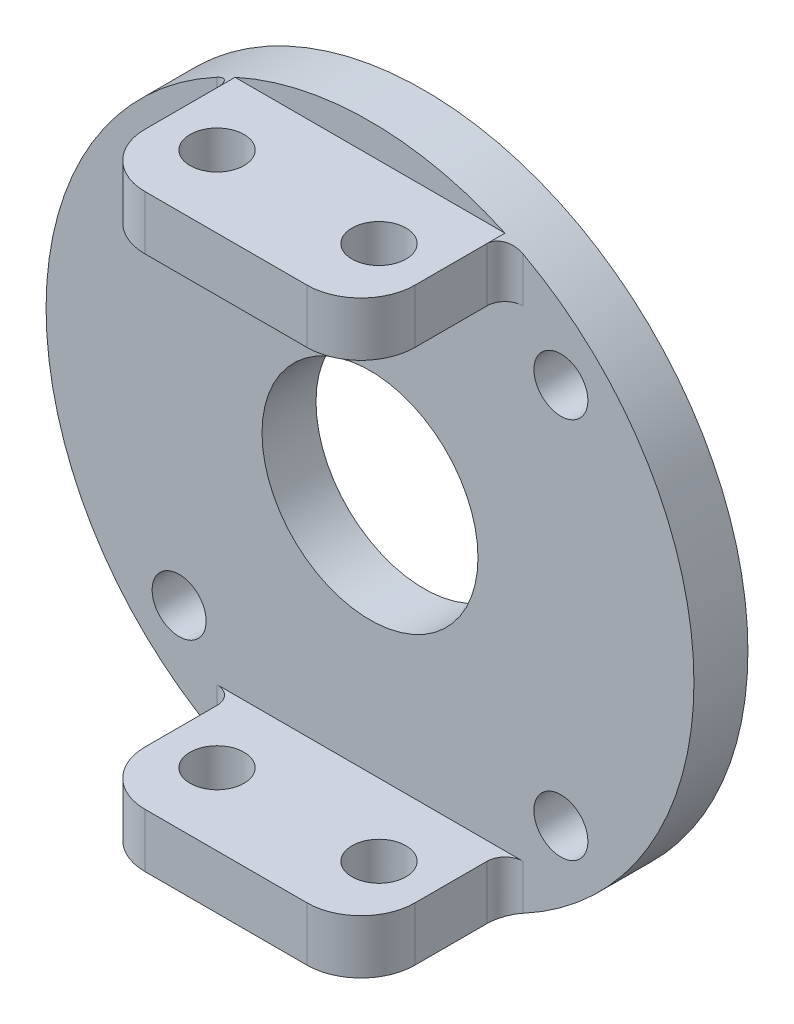
ISO-10303-21;
HEADER;
FILE_DESCRIPTION(('STEP AP214'),'2;1');
FILE_NAME('part.step','',(''),(''),'','','');
FILE_SCHEMA(('AUTOMOTIVE_DESIGN { 1 0 10303 214 1 1 1 1 }'));
ENDSEC;
DATA;
#1=APPLICATION_CONTEXT('core data for automotive mechanical design processes');
#2=APPLICATION_PROTOCOL_DEFINITION('international standard','automotive_design',2000,#1);
#3=PRODUCT_CONTEXT('',#1,'mechanical');
#4=PRODUCT('Part','Part','',(#3));
#5=PRODUCT_RELATED_PRODUCT_CATEGORY('part','',(#4));
#6=PRODUCT_DEFINITION_FORMATION('','',#4);
#7=PRODUCT_DEFINITION_CONTEXT('part definition',#1,'design');
#8=PRODUCT_DEFINITION('design','',#6,#7);
#9=PRODUCT_DEFINITION_SHAPE('','',#8);
#10=(LENGTH_UNIT() NAMED_UNIT(*) SI_UNIT(.MILLI.,.METRE.));
#11=(NAMED_UNIT(*) PLANE_ANGLE_UNIT() SI_UNIT($,.RADIAN.));
#12=(NAMED_UNIT(*) SI_UNIT($,.STERADIAN.) SOLID_ANGLE_UNIT());
#13=UNCERTAINTY_MEASURE_WITH_UNIT(LENGTH_MEASURE(1.E-05),#10,'distance_accuracy_value','');
#14=(GEOMETRIC_REPRESENTATION_CONTEXT(3) GLOBAL_UNCERTAINTY_ASSIGNED_CONTEXT((#13)) GLOBAL_UNIT_ASSIGNED_CONTEXT((#10,
#11,#12)) REPRESENTATION_CONTEXT('',''));
#15=CARTESIAN_POINT('',(0.,0.,0.));
#16=DIRECTION('',(0.,0.,1.));
#17=DIRECTION('',(1.,0.,0.));
#18=AXIS2_PLACEMENT_3D('',#15,#16,#17);
#19=CARTESIAN_POINT('',(0.,0.,3.));
#20=DIRECTION('',(0.,0.,1.));
#21=DIRECTION('',(1.,0.,0.));
#22=AXIS2_PLACEMENT_3D('',#19,#20,#21);
#23=PLANE('',#22);
#24=CARTESIAN_POINT('',(0.,0.,3.));
#25=DIRECTION('',(0.,0.,1.));
#26=DIRECTION('',(1.,0.,0.));
#27=AXIS2_PLACEMENT_3D('',#24,#25,#26);
#28=CIRCLE('',#27,6.);
#29=CARTESIAN_POINT('',(6.,0.,3.));
#30=VERTEX_POINT('',#29);
#31=EDGE_CURVE('E434',#30,#30,#28,.T.);
#32=ORIENTED_EDGE('',*,*,#31,.F.);
#33=EDGE_LOOP('',(#32));
#34=FACE_BOUND('',#33,.T.);
#35=CARTESIAN_POINT('',(-10.6066017177982,10.6066017177982,3.));
#36=DIRECTION('',(0.,0.,1.));
#37=DIRECTION('',(1.,0.,0.));
#38=AXIS2_PLACEMENT_3D('',#35,#36,#37);
#39=CIRCLE('',#38,1.5);
#40=CARTESIAN_POINT('',(-9.1066017177982,10.6066017177982,3.));
#41=VERTEX_POINT('',#40);
#42=EDGE_CURVE('E376',#41,#41,#39,.T.);
#43=ORIENTED_EDGE('',*,*,#42,.F.);
#44=EDGE_LOOP('',(#43));
#45=FACE_BOUND('',#44,.T.);
#46=CARTESIAN_POINT('',(10.6066017177987,10.6066017177986,3.));
#47=DIRECTION('',(0.,0.,1.));
#48=DIRECTION('',(1.,0.,0.));
#49=AXIS2_PLACEMENT_3D('',#46,#47,#48);
#50=CIRCLE('',#49,1.5);
#51=CARTESIAN_POINT('',(12.1066017177987,10.6066017177986,3.));
#52=VERTEX_POINT('',#51);
#53=EDGE_CURVE('E370',#52,#52,#50,.T.);
#54=ORIENTED_EDGE('',*,*,#53,.F.);
#55=EDGE_LOOP('',(#54));
#56=FACE_BOUND('',#55,.T.);
#57=CARTESIAN_POINT('',(10.606601717799,-10.6066017177982,3.));
#58=DIRECTION('',(0.,0.,1.));
#59=DIRECTION('',(1.,0.,0.));
#60=AXIS2_PLACEMENT_3D('',#57,#58,#59);
#61=CIRCLE('',#60,1.5);
#62=CARTESIAN_POINT('',(12.106601717799,-10.6066017177982,3.));
#63=VERTEX_POINT('',#62);
#64=EDGE_CURVE('E363',#63,#63,#61,.T.);
#65=ORIENTED_EDGE('',*,*,#64,.F.);
#66=EDGE_LOOP('',(#65));
#67=FACE_BOUND('',#66,.T.);
#68=CARTESIAN_POINT('',(-10.6066017177978,-10.6066017177986,3.));
#69=DIRECTION('',(0.,0.,1.));
#70=DIRECTION('',(1.,0.,0.));
#71=AXIS2_PLACEMENT_3D('',#68,#69,#70);
#72=CIRCLE('',#71,1.5);
#73=CARTESIAN_POINT('',(-9.10660171779781,-10.6066017177986,3.));
#74=VERTEX_POINT('',#73);
#75=EDGE_CURVE('E366',#74,#74,#72,.T.);
#76=ORIENTED_EDGE('',*,*,#75,.F.);
#77=EDGE_LOOP('',(#76));
#78=FACE_BOUND('',#77,.T.);
#79=CARTESIAN_POINT('',(0.,0.,3.));
#80=DIRECTION('',(0.,0.,1.));
#81=DIRECTION('',(1.,0.,0.));
#82=AXIS2_PLACEMENT_3D('',#79,#80,#81);
#83=CIRCLE('',#82,18.);
#84=CARTESIAN_POINT('',(8.49999999999999,-15.8666316526224,3.));
#85=VERTEX_POINT('',#84);
#86=CARTESIAN_POINT('',(8.49999999999999,15.8666316526224,3.));
#87=VERTEX_POINT('',#86);
#88=EDGE_CURVE('E201',#85,#87,#83,.T.);
#89=ORIENTED_EDGE('',*,*,#88,.T.);
#90=DIRECTION('',(0.,1.,0.));
#91=VECTOR('',#90,1.);
#92=CARTESIAN_POINT('',(8.49999999999999,0.,3.));
#93=LINE('',#92,#91);
#94=CARTESIAN_POINT('',(8.49999999999999,13.3630681719536,3.));
#95=VERTEX_POINT('',#94);
#96=EDGE_CURVE('E268',#87,#95,#93,.F.);
#97=ORIENTED_EDGE('',*,*,#96,.T.);
#98=DIRECTION('',(1.,0.,0.));
#99=VECTOR('',#98,1.);
#100=CARTESIAN_POINT('',(7.49999999999999,13.3630681719536,3.));
#101=LINE('',#100,#99);
#102=CARTESIAN_POINT('',(-8.50000000000001,13.3630681719536,3.));
#103=VERTEX_POINT('',#102);
#104=EDGE_CURVE('E342',#103,#95,#101,.T.);
#105=ORIENTED_EDGE('',*,*,#104,.F.);
#106=DIRECTION('',(0.,-1.,0.));
#107=VECTOR('',#106,1.);
#108=CARTESIAN_POINT('',(-8.50000000000001,0.,3.));
#109=LINE('',#108,#107);
#110=CARTESIAN_POINT('',(-8.50000000000001,15.8666316526224,3.));
#111=VERTEX_POINT('',#110);
#112=EDGE_CURVE('E261',#103,#111,#109,.F.);
#113=ORIENTED_EDGE('',*,*,#112,.T.);
#114=CARTESIAN_POINT('',(-8.50000000000001,-15.8666316526224,3.));
#115=VERTEX_POINT('',#114);
#116=EDGE_CURVE('E200',#111,#115,#83,.T.);
#117=ORIENTED_EDGE('',*,*,#116,.T.);
#118=DIRECTION('',(0.,-1.,0.));
#119=VECTOR('',#118,1.);
#120=CARTESIAN_POINT('',(-8.50000000000001,0.,3.));
#121=LINE('',#120,#119);
#122=CARTESIAN_POINT('',(-8.50000000000001,-13.3630681719536,3.));
#123=VERTEX_POINT('',#122);
#124=EDGE_CURVE('E263',#115,#123,#121,.F.);
#125=ORIENTED_EDGE('',*,*,#124,.T.);
#126=DIRECTION('',(-1.,0.,0.));
#127=VECTOR('',#126,1.);
#128=CARTESIAN_POINT('',(7.49999999999999,-13.3630681719536,3.));
#129=LINE('',#128,#127);
#130=CARTESIAN_POINT('',(8.49999999999999,-13.3630681719536,3.));
#131=VERTEX_POINT('',#130);
#132=EDGE_CURVE('E197',#131,#123,#129,.T.);
#133=ORIENTED_EDGE('',*,*,#132,.F.);
#134=DIRECTION('',(0.,1.,0.));
#135=VECTOR('',#134,1.);
#136=CARTESIAN_POINT('',(8.49999999999999,0.,3.));
#137=LINE('',#136,#135);
#138=EDGE_CURVE('E266',#131,#85,#137,.F.);
#139=ORIENTED_EDGE('',*,*,#138,.T.);
#140=EDGE_LOOP('',(#89,#97,#105,#113,#117,#125,#133,#139));
#141=FACE_BOUND('',#140,.T.);
#142=ADVANCED_FACE('F39',(#34,#45,#56,#67,#78,#141),#23,.T.);
#143=CARTESIAN_POINT('',(-7.50000000000001,-16.3630681719536,3.));
#144=VERTEX_POINT('',#143);
#145=CARTESIAN_POINT('',(7.49999999999999,-16.3630681719536,3.));
#146=VERTEX_POINT('',#145);
#147=EDGE_CURVE('E183',#144,#146,#83,.T.);
#148=ORIENTED_EDGE('',*,*,#147,.T.);
#149=DIRECTION('',(1.,0.,0.));
#150=VECTOR('',#149,1.);
#151=CARTESIAN_POINT('',(7.49999999999999,-16.3630681719536,3.));
#152=LINE('',#151,#150);
#153=EDGE_CURVE('E191',#144,#146,#152,.T.);
#154=ORIENTED_EDGE('',*,*,#153,.F.);
#155=EDGE_LOOP('',(#148,#154));
#156=FACE_BOUND('',#155,.T.);
#157=ADVANCED_FACE('F199',(#156),#23,.T.);
#158=CARTESIAN_POINT('',(0.,0.,3.));
#159=DIRECTION('',(0.,0.,-1.));
#160=DIRECTION('',(-1.,0.,0.));
#161=AXIS2_PLACEMENT_3D('',#158,#159,#160);
#162=CYLINDRICAL_SURFACE('',#161,18.);
#163=CARTESIAN_POINT('',(7.49999999999999,16.3630681719536,3.));
#164=VERTEX_POINT('',#163);
#165=CARTESIAN_POINT('',(-7.49999999999999,16.3630681719536,3.));
#166=VERTEX_POINT('',#165);
#167=EDGE_CURVE('E203',#164,#166,#83,.T.);
#168=ORIENTED_EDGE('',*,*,#167,.F.);
#169=DIRECTION('',(0.,0.,-1.));
#170=VECTOR('',#169,1.);
#171=CARTESIAN_POINT('',(7.49999999999999,16.3630681719536,3.));
#172=LINE('',#171,#170);
#173=CARTESIAN_POINT('',(7.49999999999999,16.3630681719536,3.99999692167224));
#174=VERTEX_POINT('',#173);
#175=EDGE_CURVE('E188',#164,#174,#172,.F.);
#176=ORIENTED_EDGE('',*,*,#175,.T.);
#177=CARTESIAN_POINT('',(7.49999999999999,16.3630681719536,3.99999692167224));
#178=CARTESIAN_POINT('',(7.49999906959329,16.363068213124,3.97377746304186));
#179=CARTESIAN_POINT('',(7.50103210284453,16.3625951483983,3.9475712003001));
#180=CARTESIAN_POINT('',(7.50514513994182,16.3607091554196,3.895359347736));
#181=CARTESIAN_POINT('',(7.508224710732,16.3592964260036,3.86935371663661));
#182=CARTESIAN_POINT('',(7.52047080910208,16.3536724968244,3.79208217480843));
#183=CARTESIAN_POINT('',(7.53264509680496,16.3480754318929,3.74135622528795));
#184=CARTESIAN_POINT('',(7.56449400341762,16.3333625871327,3.64291624295453));
#185=CARTESIAN_POINT('',(7.58416633864592,16.3242478786627,3.59520129823174));
#186=CARTESIAN_POINT('',(7.6302254590377,16.3027697955073,3.50390839302677));
#187=CARTESIAN_POINT('',(7.65661532963729,16.2904049279036,3.46033234624808));
#188=CARTESIAN_POINT('',(7.71611460047297,16.2623088668794,3.37691446806265));
#189=CARTESIAN_POINT('',(7.74941801901627,16.2464795313242,3.33724466774492));
#190=CARTESIAN_POINT('',(7.8210108817137,16.212136333305,3.26406792158904));
#191=CARTESIAN_POINT('',(7.85930111830242,16.193622044133,3.23056195726633));
#192=CARTESIAN_POINT('',(7.94318248016245,16.1526532569827,3.16757257723188));
#193=CARTESIAN_POINT('',(7.98911807130294,16.1299970590754,3.13868000421383));
#194=CARTESIAN_POINT('',(8.08418884070084,16.0825595754291,3.08896564956935));
#195=CARTESIAN_POINT('',(8.13332718687691,16.0577761777104,3.06815200494731));
#196=CARTESIAN_POINT('',(8.23501813770788,16.0058679190439,3.03421398459593));
#197=CARTESIAN_POINT('',(8.28762895335781,15.9786951050233,3.02133916818562));
#198=CARTESIAN_POINT('',(8.39355668472013,15.9233118119501,3.00423499280313));
#199=CARTESIAN_POINT('',(8.4468717613867,15.8951037854846,2.99998639279836));
#200=CARTESIAN_POINT('',(8.49999999999999,15.8666316526224,3.));
#201=B_SPLINE_CURVE_WITH_KNOTS('',3,(#177,#178,#179,#180,#181,#182,#183,#184,#185,#186,#187,
#188,#189,#190,#191,#192,#193,#194,#195,#196,#197,#198,#199,#200),.UNSPECIFIED.,.F.,.F.,(4,2,2,
2,2,2,2,2,2,2,2,4),(0.,0.0786078859809473,0.157199143499488,0.313773673628582,0.47030055388653,
0.6268994587575,0.788698011420957,0.950522306263999,1.1262153749771,1.30208494339878,
1.48323352999681,1.66397761341098),.UNSPECIFIED.);
#202=EDGE_CURVE('E278',#174,#87,#201,.T.);
#203=ORIENTED_EDGE('',*,*,#202,.T.);
#204=ORIENTED_EDGE('',*,*,#88,.F.);
#205=CARTESIAN_POINT('',(8.49999999999999,-15.8666316526224,3.));
#206=CARTESIAN_POINT('',(8.43916990337772,-15.8992373928385,2.99997519727107));
#207=CARTESIAN_POINT('',(8.37807811726127,-15.9314972343745,3.00555292523649));
#208=CARTESIAN_POINT('',(8.25694195489614,-15.9946065993855,3.02803164898108));
#209=CARTESIAN_POINT('',(8.19690303814943,-16.0254496490803,3.04497997918803));
#210=CARTESIAN_POINT('',(8.07983458637217,-16.0847950172863,3.09037754460401));
#211=CARTESIAN_POINT('',(8.02281311856052,-16.1132911641968,3.11885600687197));
#212=CARTESIAN_POINT('',(7.91421926562691,-16.1669039845689,3.18700707910457));
#213=CARTESIAN_POINT('',(7.86263710002976,-16.1920267467942,3.22665910924165));
#214=CARTESIAN_POINT('',(7.77118077076012,-16.2361054232388,3.31266443037111));
#215=CARTESIAN_POINT('',(7.73068957167159,-16.2554005094723,3.35818572203846));
#216=CARTESIAN_POINT('',(7.65808281912688,-16.2897325261304,3.45693217665807));
#217=CARTESIAN_POINT('',(7.62596591739042,-16.3047701420507,3.5101560973217));
#218=CARTESIAN_POINT('',(7.57478222794618,-16.3286064091098,3.61649610700836));
#219=CARTESIAN_POINT('',(7.55468220010223,-16.3379027061641,3.66900593822452));
#220=CARTESIAN_POINT('',(7.5235360102668,-16.3522691452454,3.77713955681173));
#221=CARTESIAN_POINT('',(7.51247018528037,-16.3573484659562,3.83275629834699));
#222=CARTESIAN_POINT('',(7.50412502330198,-16.3611769050168,3.90736965905927));
#223=CARTESIAN_POINT('',(7.502578046402,-16.3618863025709,3.92586885212196));
#224=CARTESIAN_POINT('',(7.50051699796983,-16.362831253093,3.9629079335694));
#225=CARTESIAN_POINT('',(7.50000132567539,-16.3630675404102,3.98144771410044));
#226=CARTESIAN_POINT('',(7.50000000000472,-16.3630681719514,3.99999692167288));
#227=B_SPLINE_CURVE_WITH_KNOTS('',3,(#205,#206,#207,#208,#209,#210,#211,#212,#213,#214,#215,
#216,#217,#218,#219,#220,#221,#222,#223,#224,#225,#226),.UNSPECIFIED.,.F.,.F.,(4,2,2,2,2,2,2,2,
2,2,4),(0.,0.206934156914236,0.414735145144142,0.623066207174348,0.831016038743668,
1.02166485785971,1.21228296311682,1.38236291342492,1.55207168936954,1.60777838818518,
1.66339855329863),.UNSPECIFIED.);
#228=CARTESIAN_POINT('',(7.49999999999999,-16.3630681719536,4.));
#229=VERTEX_POINT('',#228);
#230=EDGE_CURVE('E186',#85,#229,#227,.T.);
#231=ORIENTED_EDGE('',*,*,#230,.T.);
#232=DIRECTION('',(0.,0.,-1.));
#233=VECTOR('',#232,1.);
#234=CARTESIAN_POINT('',(7.49999999999999,-16.3630681719536,3.));
#235=LINE('',#234,#233);
#236=EDGE_CURVE('E177',#146,#229,#235,.F.);
#237=ORIENTED_EDGE('',*,*,#236,.F.);
#238=ORIENTED_EDGE('',*,*,#147,.F.);
#239=DIRECTION('',(0.,0.,-1.));
#240=VECTOR('',#239,1.);
#241=CARTESIAN_POINT('',(-7.50000000000001,-16.3630681719536,3.));
#242=LINE('',#241,#240);
#243=CARTESIAN_POINT('',(-7.49999999999999,-16.3630681719536,3.99999692617055));
#244=VERTEX_POINT('',#243);
#245=EDGE_CURVE('E49',#144,#244,#242,.F.);
#246=ORIENTED_EDGE('',*,*,#245,.T.);
#247=CARTESIAN_POINT('',(-7.49999999999999,-16.3630681719536,3.99999692617055));
#248=CARTESIAN_POINT('',(-7.49999906947535,-16.363068213178,3.97377746755587));
#249=CARTESIAN_POINT('',(-7.50103210260747,-16.3625951485069,3.94757120482416));
#250=CARTESIAN_POINT('',(-7.50514513946546,-16.3607091556381,3.89535935226859));
#251=CARTESIAN_POINT('',(-7.50822471013544,-16.3592964262773,3.86935372116771));
#252=CARTESIAN_POINT('',(-7.52047080814633,-16.3536724972637,3.79208217931677));
#253=CARTESIAN_POINT('',(-7.53264509561061,-16.3480754324429,3.74135622975794));
#254=CARTESIAN_POINT('',(-7.56449400175819,-16.333362587901,3.64291624730406));
#255=CARTESIAN_POINT('',(-7.58416633676014,-16.3242478795385,3.59520130249921));
#256=CARTESIAN_POINT('',(-7.63022545671883,-16.3027697965923,3.5039083970932));
#257=CARTESIAN_POINT('',(-7.65661532711164,-16.2904049290902,3.4603323501955));
#258=CARTESIAN_POINT('',(-7.7161145975381,-16.2623088682714,3.37691447175729));
#259=CARTESIAN_POINT('',(-7.74941801587694,-16.2464795328211,3.33724467130222));
#260=CARTESIAN_POINT('',(-7.82101087819067,-16.212136335004,3.26406792484125));
#261=CARTESIAN_POINT('',(-7.85930111460013,-16.1936220459293,3.23056196035074));
#262=CARTESIAN_POINT('',(-7.94318247609677,-16.1526532589814,3.16757257995471));
#263=CARTESIAN_POINT('',(-7.9891180670537,-16.1299970611793,3.1386800067374));
#264=CARTESIAN_POINT('',(-8.08418883611692,-16.0825595777326,3.08896565166431));
#265=CARTESIAN_POINT('',(-8.13332718214202,-16.0577761801081,3.06815200681317));
#266=CARTESIAN_POINT('',(-8.23501813358568,-16.0058679211677,3.03421398567753));
#267=CARTESIAN_POINT('',(-8.28762895003505,-15.97869510675,3.02133916886016));
#268=CARTESIAN_POINT('',(-8.39355668304088,-15.9233118128389,3.00423499293628));
#269=CARTESIAN_POINT('',(-8.44687176055147,-15.8951037859328,2.99998639279692));
#270=CARTESIAN_POINT('',(-8.50000000000001,-15.8666316526224,3.));
#271=B_SPLINE_CURVE_WITH_KNOTS('',3,(#247,#248,#249,#250,#251,#252,#253,#254,#255,#256,#257,
#258,#259,#260,#261,#262,#263,#264,#265,#266,#267,#268,#269,#270),.UNSPECIFIED.,.F.,.F.,(4,2,2,
2,2,2,2,2,2,2,2,4),(0.,0.0786078859339404,0.157199143405793,0.313773673445075,0.470300553616036,
0.626899458399007,0.788698010895359,0.950522305569873,1.12621537402539,1.3020849421953,
1.48323353163652,1.66397761789456),.UNSPECIFIED.);
#272=EDGE_CURVE('E79',#244,#115,#271,.T.);
#273=ORIENTED_EDGE('',*,*,#272,.T.);
#274=ORIENTED_EDGE('',*,*,#116,.F.);
#275=CARTESIAN_POINT('',(-8.50000000000001,15.8666316526224,3.));
#276=CARTESIAN_POINT('',(-8.43916990337762,15.8992373928386,2.99997519727107));
#277=CARTESIAN_POINT('',(-8.37807811726106,15.9314972343746,3.00555292523651));
#278=CARTESIAN_POINT('',(-8.25694195489593,15.9946065993856,3.02803164898115));
#279=CARTESIAN_POINT('',(-8.19690303814934,16.0254496490804,3.04497997918807));
#280=CARTESIAN_POINT('',(-8.07983458637233,16.0847950172863,3.09037754460396));
#281=CARTESIAN_POINT('',(-8.02281311856081,16.1132911641967,3.11885600687184));
#282=CARTESIAN_POINT('',(-7.91421926562718,16.1669039845687,3.18700707910438));
#283=CARTESIAN_POINT('',(-7.8626371000299,16.1920267467941,3.22665910924153));
#284=CARTESIAN_POINT('',(-7.77118077075982,16.236105423239,3.31266443037142));
#285=CARTESIAN_POINT('',(-7.73068957167101,16.2554005094725,3.35818572203915));
#286=CARTESIAN_POINT('',(-7.65808281912644,16.2897325261306,3.45693217665883));
#287=CARTESIAN_POINT('',(-7.62596591739026,16.3047701420508,3.51015609732204));
#288=CARTESIAN_POINT('',(-7.57478222794675,16.3286064091095,3.61649610700726));
#289=CARTESIAN_POINT('',(-7.55468220010315,16.3379027061637,3.66900593822231));
#290=CARTESIAN_POINT('',(-7.52353601026739,16.3522691452452,3.77713955680884));
#291=CARTESIAN_POINT('',(-7.5124701852807,16.3573484659561,3.83275629834468));
#292=CARTESIAN_POINT('',(-7.50412502322535,16.3611769050519,3.90736965974449));
#293=CARTESIAN_POINT('',(-7.50257804628696,16.3618863026237,3.92586885349705));
#294=CARTESIAN_POINT('',(-7.50051699785482,16.3628312531457,3.96290793632552));
#295=CARTESIAN_POINT('',(-7.50000132559867,16.3630675404453,3.98144771754772));
#296=CARTESIAN_POINT('',(-7.50000000000473,16.3630681719514,3.99999692580927));
#297=B_SPLINE_CURVE_WITH_KNOTS('',3,(#275,#276,#277,#278,#279,#280,#281,#282,#283,#284,#285,
#286,#287,#288,#289,#290,#291,#292,#293,#294,#295,#296),.UNSPECIFIED.,.F.,.F.,(4,2,2,2,2,2,2,2,
2,2,4),(0.,0.20693415691463,0.41473514514414,0.623066207173856,0.831016038743669,
1.02166485786111,1.21228296311682,1.38236291342094,1.55207168936954,1.60777839025434,
1.66339855743308),.UNSPECIFIED.);
#298=CARTESIAN_POINT('',(-7.50000000000001,16.3630681719536,4.));
#299=VERTEX_POINT('',#298);
#300=EDGE_CURVE('E317',#111,#299,#297,.T.);
#301=ORIENTED_EDGE('',*,*,#300,.T.);
#302=DIRECTION('',(0.,0.,-1.));
#303=VECTOR('',#302,1.);
#304=CARTESIAN_POINT('',(-7.49999999999999,16.3630681719536,3.));
#305=LINE('',#304,#303);
#306=EDGE_CURVE('E11',#166,#299,#305,.F.);
#307=ORIENTED_EDGE('',*,*,#306,.F.);
#308=EDGE_LOOP('',(#168,#176,#203,#204,#231,#237,#238,#246,#273,#274,#301,#307));
#309=FACE_BOUND('',#308,.T.);
#310=CARTESIAN_POINT('',(0.,0.,0.));
#311=DIRECTION('',(0.,0.,1.));
#312=DIRECTION('',(1.,0.,0.));
#313=AXIS2_PLACEMENT_3D('',#310,#311,#312);
#314=CIRCLE('',#313,18.);
#315=CARTESIAN_POINT('',(18.,0.,0.));
#316=VERTEX_POINT('',#315);
#317=EDGE_CURVE('E206',#316,#316,#314,.T.);
#318=ORIENTED_EDGE('',*,*,#317,.T.);
#319=EDGE_LOOP('',(#318));
#320=FACE_BOUND('',#319,.T.);
#321=ADVANCED_FACE('F180',(#309,#320),#162,.T.);
#322=DIRECTION('',(-1.,0.,0.));
#323=VECTOR('',#322,1.);
#324=CARTESIAN_POINT('',(7.49999999999999,16.3630681719536,3.));
#325=LINE('',#324,#323);
#326=EDGE_CURVE('E347',#164,#166,#325,.T.);
#327=ORIENTED_EDGE('',*,*,#326,.F.);
#328=ORIENTED_EDGE('',*,*,#167,.T.);
#329=EDGE_LOOP('',(#327,#328));
#330=FACE_BOUND('',#329,.T.);
#331=ADVANCED_FACE('F392',(#330),#23,.T.);
#332=CARTESIAN_POINT('',(0.,0.,0.));
#333=DIRECTION('',(0.,0.,1.));
#334=DIRECTION('',(1.,0.,0.));
#335=AXIS2_PLACEMENT_3D('',#332,#333,#334);
#336=PLANE('',#335);
#337=CARTESIAN_POINT('',(0.,0.,0.));
#338=DIRECTION('',(0.,0.,1.));
#339=DIRECTION('',(1.,0.,0.));
#340=AXIS2_PLACEMENT_3D('',#337,#338,#339);
#341=CIRCLE('',#340,6.);
#342=CARTESIAN_POINT('',(6.,0.,0.));
#343=VERTEX_POINT('',#342);
#344=EDGE_CURVE('E44',#343,#343,#341,.T.);
#345=ORIENTED_EDGE('',*,*,#344,.T.);
#346=EDGE_LOOP('',(#345));
#347=FACE_BOUND('',#346,.T.);
#348=CARTESIAN_POINT('',(-10.6066017177982,10.6066017177982,0.));
#349=DIRECTION('',(0.,0.,1.));
#350=DIRECTION('',(1.,0.,0.));
#351=AXIS2_PLACEMENT_3D('',#348,#349,#350);
#352=CIRCLE('',#351,1.5);
#353=CARTESIAN_POINT('',(-9.1066017177982,10.6066017177982,0.));
#354=VERTEX_POINT('',#353);
#355=EDGE_CURVE('E362',#354,#354,#352,.T.);
#356=ORIENTED_EDGE('',*,*,#355,.T.);
#357=EDGE_LOOP('',(#356));
#358=FACE_BOUND('',#357,.T.);
#359=CARTESIAN_POINT('',(10.6066017177987,10.6066017177986,0.));
#360=DIRECTION('',(0.,0.,1.));
#361=DIRECTION('',(1.,0.,0.));
#362=AXIS2_PLACEMENT_3D('',#359,#360,#361);
#363=CIRCLE('',#362,1.5);
#364=CARTESIAN_POINT('',(12.1066017177987,10.6066017177986,0.));
#365=VERTEX_POINT('',#364);
#366=EDGE_CURVE('E373',#365,#365,#363,.T.);
#367=ORIENTED_EDGE('',*,*,#366,.T.);
#368=EDGE_LOOP('',(#367));
#369=FACE_BOUND('',#368,.T.);
#370=CARTESIAN_POINT('',(10.606601717799,-10.6066017177982,0.));
#371=DIRECTION('',(0.,0.,1.));
#372=DIRECTION('',(1.,0.,0.));
#373=AXIS2_PLACEMENT_3D('',#370,#371,#372);
#374=CIRCLE('',#373,1.5);
#375=CARTESIAN_POINT('',(12.106601717799,-10.6066017177982,0.));
#376=VERTEX_POINT('',#375);
#377=EDGE_CURVE('E367',#376,#376,#374,.T.);
#378=ORIENTED_EDGE('',*,*,#377,.T.);
#379=EDGE_LOOP('',(#378));
#380=FACE_BOUND('',#379,.T.);
#381=CARTESIAN_POINT('',(-10.6066017177978,-10.6066017177986,0.));
#382=DIRECTION('',(0.,0.,1.));
#383=DIRECTION('',(1.,0.,0.));
#384=AXIS2_PLACEMENT_3D('',#381,#382,#383);
#385=CIRCLE('',#384,1.5);
#386=CARTESIAN_POINT('',(-9.10660171779781,-10.6066017177986,0.));
#387=VERTEX_POINT('',#386);
#388=EDGE_CURVE('E381',#387,#387,#385,.T.);
#389=ORIENTED_EDGE('',*,*,#388,.T.);
#390=EDGE_LOOP('',(#389));
#391=FACE_BOUND('',#390,.T.);
#392=ORIENTED_EDGE('',*,*,#317,.F.);
#393=EDGE_LOOP('',(#392));
#394=FACE_BOUND('',#393,.T.);
#395=ADVANCED_FACE('F441',(#347,#358,#369,#380,#391,#394),#336,.F.);
#396=CARTESIAN_POINT('',(-10.6066017177978,-10.6066017177986,0.));
#397=DIRECTION('',(0.,0.,1.));
#398=DIRECTION('',(1.,0.,0.));
#399=AXIS2_PLACEMENT_3D('',#396,#397,#398);
#400=CYLINDRICAL_SURFACE('',#399,1.5);
#401=ORIENTED_EDGE('',*,*,#388,.F.);
#402=EDGE_LOOP('',(#401));
#403=FACE_BOUND('',#402,.T.);
#404=ORIENTED_EDGE('',*,*,#75,.T.);
#405=EDGE_LOOP('',(#404));
#406=FACE_BOUND('',#405,.T.);
#407=ADVANCED_FACE('F386',(#403,#406),#400,.F.);
#408=CARTESIAN_POINT('',(10.606601717799,-10.6066017177982,0.));
#409=DIRECTION('',(0.,0.,1.));
#410=DIRECTION('',(1.,0.,0.));
#411=AXIS2_PLACEMENT_3D('',#408,#409,#410);
#412=CYLINDRICAL_SURFACE('',#411,1.5);
#413=ORIENTED_EDGE('',*,*,#377,.F.);
#414=EDGE_LOOP('',(#413));
#415=FACE_BOUND('',#414,.T.);
#416=ORIENTED_EDGE('',*,*,#64,.T.);
#417=EDGE_LOOP('',(#416));
#418=FACE_BOUND('',#417,.T.);
#419=ADVANCED_FACE('F494',(#415,#418),#412,.F.);
#420=CARTESIAN_POINT('',(10.6066017177987,10.6066017177986,0.));
#421=DIRECTION('',(0.,0.,1.));
#422=DIRECTION('',(1.,0.,0.));
#423=AXIS2_PLACEMENT_3D('',#420,#421,#422);
#424=CYLINDRICAL_SURFACE('',#423,1.5);
#425=ORIENTED_EDGE('',*,*,#366,.F.);
#426=EDGE_LOOP('',(#425));
#427=FACE_BOUND('',#426,.T.);
#428=ORIENTED_EDGE('',*,*,#53,.T.);
#429=EDGE_LOOP('',(#428));
#430=FACE_BOUND('',#429,.T.);
#431=ADVANCED_FACE('F497',(#427,#430),#424,.F.);
#432=CARTESIAN_POINT('',(-10.6066017177982,10.6066017177982,0.));
#433=DIRECTION('',(0.,0.,1.));
#434=DIRECTION('',(1.,0.,0.));
#435=AXIS2_PLACEMENT_3D('',#432,#433,#434);
#436=CYLINDRICAL_SURFACE('',#435,1.5);
#437=ORIENTED_EDGE('',*,*,#355,.F.);
#438=EDGE_LOOP('',(#437));
#439=FACE_BOUND('',#438,.T.);
#440=ORIENTED_EDGE('',*,*,#42,.T.);
#441=EDGE_LOOP('',(#440));
#442=FACE_BOUND('',#441,.T.);
#443=ADVANCED_FACE('F493',(#439,#442),#436,.F.);
#444=CARTESIAN_POINT('',(-7.50000000000001,16.3630681719536,11.));
#445=DIRECTION('',(1.,0.,0.));
#446=DIRECTION('',(0.,0.,-1.));
#447=AXIS2_PLACEMENT_3D('',#444,#445,#446);
#448=PLANE('',#447);
#449=DIRECTION('',(0.,0.,-1.));
#450=VECTOR('',#449,1.);
#451=CARTESIAN_POINT('',(-7.50000000000001,16.3630681719536,11.));
#452=LINE('',#451,#450);
#453=CARTESIAN_POINT('',(-7.50000000000001,16.3630681719536,8.));
#454=VERTEX_POINT('',#453);
#455=EDGE_CURVE('E56',#454,#299,#452,.T.);
#456=ORIENTED_EDGE('',*,*,#455,.T.);
#457=DIRECTION('',(0.,-1.,0.));
#458=VECTOR('',#457,1.);
#459=CARTESIAN_POINT('',(-7.50000000000001,16.3630681719536,4.));
#460=LINE('',#459,#458);
#461=CARTESIAN_POINT('',(-7.50000000000001,13.3630681719536,4.));
#462=VERTEX_POINT('',#461);
#463=EDGE_CURVE('E276',#299,#462,#460,.T.);
#464=ORIENTED_EDGE('',*,*,#463,.T.);
#465=DIRECTION('',(0.,0.,-1.));
#466=VECTOR('',#465,1.);
#467=CARTESIAN_POINT('',(-7.50000000000001,13.3630681719536,11.));
#468=LINE('',#467,#466);
#469=CARTESIAN_POINT('',(-7.50000000000001,13.3630681719536,8.));
#470=VERTEX_POINT('',#469);
#471=EDGE_CURVE('E359',#470,#462,#468,.T.);
#472=ORIENTED_EDGE('',*,*,#471,.F.);
#473=DIRECTION('',(0.,-1.,0.));
#474=VECTOR('',#473,1.);
#475=CARTESIAN_POINT('',(-7.50000000000001,16.3630681719536,8.));
#476=LINE('',#475,#474);
#477=EDGE_CURVE('E256',#470,#454,#476,.F.);
#478=ORIENTED_EDGE('',*,*,#477,.T.);
#479=EDGE_LOOP('',(#456,#464,#472,#478));
#480=FACE_BOUND('',#479,.T.);
#481=ADVANCED_FACE('F490',(#480),#448,.F.);
#482=CARTESIAN_POINT('',(7.49999999999999,13.3630681719536,11.));
#483=DIRECTION('',(0.,1.,0.));
#484=DIRECTION('',(-1.,0.,0.));
#485=AXIS2_PLACEMENT_3D('',#482,#483,#484);
#486=PLANE('',#485);
#487=CARTESIAN_POINT('',(-4.5,13.3630681719536,7.));
#488=DIRECTION('',(0.,1.,0.));
#489=DIRECTION('',(-1.,0.,0.));
#490=AXIS2_PLACEMENT_3D('',#487,#488,#489);
#491=CIRCLE('',#490,1.5);
#492=CARTESIAN_POINT('',(-6.,13.3630681719536,7.));
#493=VERTEX_POINT('',#492);
#494=EDGE_CURVE('E413',#493,#493,#491,.T.);
#495=ORIENTED_EDGE('',*,*,#494,.T.);
#496=EDGE_LOOP('',(#495));
#497=FACE_BOUND('',#496,.T.);
#498=CARTESIAN_POINT('',(4.5,13.3630681719536,7.));
#499=DIRECTION('',(0.,1.,0.));
#500=DIRECTION('',(-1.,0.,0.));
#501=AXIS2_PLACEMENT_3D('',#498,#499,#500);
#502=CIRCLE('',#501,1.5);
#503=CARTESIAN_POINT('',(3.,13.3630681719536,7.));
#504=VERTEX_POINT('',#503);
#505=EDGE_CURVE('E421',#504,#504,#502,.T.);
#506=ORIENTED_EDGE('',*,*,#505,.T.);
#507=EDGE_LOOP('',(#506));
#508=FACE_BOUND('',#507,.T.);
#509=DIRECTION('',(0.,0.,-1.));
#510=VECTOR('',#509,1.);
#511=CARTESIAN_POINT('',(7.49999999999999,13.3630681719536,11.));
#512=LINE('',#511,#510);
#513=CARTESIAN_POINT('',(7.49999999999999,13.3630681719536,8.));
#514=VERTEX_POINT('',#513);
#515=CARTESIAN_POINT('',(7.49999999999999,13.3630681719536,4.));
#516=VERTEX_POINT('',#515);
#517=EDGE_CURVE('E356',#514,#516,#512,.T.);
#518=ORIENTED_EDGE('',*,*,#517,.F.);
#519=CARTESIAN_POINT('',(4.49999999999999,13.3630681719536,8.));
#520=DIRECTION('',(0.,1.,0.));
#521=DIRECTION('',(-1.,0.,0.));
#522=AXIS2_PLACEMENT_3D('',#519,#520,#521);
#523=CIRCLE('',#522,3.);
#524=CARTESIAN_POINT('',(4.49999999999999,13.3630681719536,11.));
#525=VERTEX_POINT('',#524);
#526=EDGE_CURVE('E254',#514,#525,#523,.F.);
#527=ORIENTED_EDGE('',*,*,#526,.T.);
#528=DIRECTION('',(1.,0.,0.));
#529=VECTOR('',#528,1.);
#530=CARTESIAN_POINT('',(7.49999999999999,13.3630681719536,11.));
#531=LINE('',#530,#529);
#532=CARTESIAN_POINT('',(-4.50000000000001,13.3630681719536,11.));
#533=VERTEX_POINT('',#532);
#534=EDGE_CURVE('E343',#533,#525,#531,.T.);
#535=ORIENTED_EDGE('',*,*,#534,.F.);
#536=CARTESIAN_POINT('',(-4.50000000000001,13.3630681719536,8.));
#537=DIRECTION('',(0.,1.,0.));
#538=DIRECTION('',(-1.,0.,0.));
#539=AXIS2_PLACEMENT_3D('',#536,#537,#538);
#540=CIRCLE('',#539,3.);
#541=EDGE_CURVE('E252',#533,#470,#540,.F.);
#542=ORIENTED_EDGE('',*,*,#541,.T.);
#543=ORIENTED_EDGE('',*,*,#471,.T.);
#544=CARTESIAN_POINT('',(-8.50000000000001,13.3630681719536,4.));
#545=DIRECTION('',(0.,1.,0.));
#546=DIRECTION('',(-1.,0.,0.));
#547=AXIS2_PLACEMENT_3D('',#544,#545,#546);
#548=CIRCLE('',#547,1.);
#549=EDGE_CURVE('E314',#462,#103,#548,.T.);
#550=ORIENTED_EDGE('',*,*,#549,.T.);
#551=ORIENTED_EDGE('',*,*,#104,.T.);
#552=CARTESIAN_POINT('',(8.49999999999999,13.3630681719536,4.));
#553=DIRECTION('',(0.,1.,0.));
#554=DIRECTION('',(-1.,0.,0.));
#555=AXIS2_PLACEMENT_3D('',#552,#553,#554);
#556=CIRCLE('',#555,1.);
#557=EDGE_CURVE('E285',#95,#516,#556,.T.);
#558=ORIENTED_EDGE('',*,*,#557,.T.);
#559=EDGE_LOOP('',(#518,#527,#535,#542,#543,#550,#551,#558));
#560=FACE_BOUND('',#559,.T.);
#561=ADVANCED_FACE('F486',(#497,#508,#560),#486,.F.);
#562=CARTESIAN_POINT('',(7.49999999999999,16.3630681719536,11.));
#563=DIRECTION('',(-1.,0.,0.));
#564=DIRECTION('',(0.,0.,1.));
#565=AXIS2_PLACEMENT_3D('',#562,#563,#564);
#566=PLANE('',#565);
#567=ORIENTED_EDGE('',*,*,#517,.T.);
#568=DIRECTION('',(0.,1.,0.));
#569=VECTOR('',#568,1.);
#570=CARTESIAN_POINT('',(7.49999999999999,16.3630681719536,4.));
#571=LINE('',#570,#569);
#572=EDGE_CURVE('E258',#516,#174,#571,.T.);
#573=ORIENTED_EDGE('',*,*,#572,.T.);
#574=DIRECTION('',(0.,0.,-1.));
#575=VECTOR('',#574,1.);
#576=CARTESIAN_POINT('',(7.49999999999999,16.3630681719536,11.));
#577=LINE('',#576,#575);
#578=CARTESIAN_POINT('',(7.49999999999999,16.3630681719536,8.));
#579=VERTEX_POINT('',#578);
#580=EDGE_CURVE('E353',#579,#174,#577,.T.);
#581=ORIENTED_EDGE('',*,*,#580,.F.);
#582=DIRECTION('',(0.,1.,0.));
#583=VECTOR('',#582,1.);
#584=CARTESIAN_POINT('',(7.49999999999999,16.3630681719536,8.));
#585=LINE('',#584,#583);
#586=EDGE_CURVE('E250',#579,#514,#585,.F.);
#587=ORIENTED_EDGE('',*,*,#586,.T.);
#588=EDGE_LOOP('',(#567,#573,#581,#587));
#589=FACE_BOUND('',#588,.T.);
#590=ADVANCED_FACE('F482',(#589),#566,.F.);
#591=CARTESIAN_POINT('',(7.49999999999999,16.3630681719536,11.));
#592=DIRECTION('',(0.,-1.,0.));
#593=DIRECTION('',(0.,0.,-1.));
#594=AXIS2_PLACEMENT_3D('',#591,#592,#593);
#595=PLANE('',#594);
#596=CARTESIAN_POINT('',(-4.5,16.3630681719536,7.));
#597=DIRECTION('',(0.,1.,0.));
#598=DIRECTION('',(0.,0.,1.));
#599=AXIS2_PLACEMENT_3D('',#596,#597,#598);
#600=CIRCLE('',#599,1.5);
#601=CARTESIAN_POINT('',(-4.5,16.3630681719536,8.5));
#602=VERTEX_POINT('',#601);
#603=EDGE_CURVE('E431',#602,#602,#600,.T.);
#604=ORIENTED_EDGE('',*,*,#603,.F.);
#605=EDGE_LOOP('',(#604));
#606=FACE_BOUND('',#605,.T.);
#607=CARTESIAN_POINT('',(4.5,16.3630681719536,7.));
#608=DIRECTION('',(0.,1.,0.));
#609=DIRECTION('',(0.,0.,-1.));
#610=AXIS2_PLACEMENT_3D('',#607,#608,#609);
#611=CIRCLE('',#610,1.5);
#612=CARTESIAN_POINT('',(4.5,16.3630681719536,5.5));
#613=VERTEX_POINT('',#612);
#614=EDGE_CURVE('E428',#613,#613,#611,.T.);
#615=ORIENTED_EDGE('',*,*,#614,.F.);
#616=EDGE_LOOP('',(#615));
#617=FACE_BOUND('',#616,.T.);
#618=DIRECTION('',(-1.,0.,0.));
#619=VECTOR('',#618,1.);
#620=CARTESIAN_POINT('',(7.49999999999999,16.3630681719536,11.));
#621=LINE('',#620,#619);
#622=CARTESIAN_POINT('',(4.49999999999999,16.3630681719536,11.));
#623=VERTEX_POINT('',#622);
#624=CARTESIAN_POINT('',(-4.50000000000001,16.3630681719536,11.));
#625=VERTEX_POINT('',#624);
#626=EDGE_CURVE('E346',#623,#625,#621,.T.);
#627=ORIENTED_EDGE('',*,*,#626,.F.);
#628=CARTESIAN_POINT('',(4.49999999999999,16.3630681719536,8.));
#629=DIRECTION('',(0.,-1.,0.));
#630=DIRECTION('',(0.,0.,-1.));
#631=AXIS2_PLACEMENT_3D('',#628,#629,#630);
#632=CIRCLE('',#631,3.);
#633=EDGE_CURVE('E248',#623,#579,#632,.F.);
#634=ORIENTED_EDGE('',*,*,#633,.T.);
#635=ORIENTED_EDGE('',*,*,#580,.T.);
#636=ORIENTED_EDGE('',*,*,#175,.F.);
#637=ORIENTED_EDGE('',*,*,#326,.T.);
#638=ORIENTED_EDGE('',*,*,#306,.T.);
#639=ORIENTED_EDGE('',*,*,#455,.F.);
#640=CARTESIAN_POINT('',(-4.50000000000001,16.3630681719536,8.));
#641=DIRECTION('',(0.,-1.,0.));
#642=DIRECTION('',(0.,0.,-1.));
#643=AXIS2_PLACEMENT_3D('',#640,#641,#642);
#644=CIRCLE('',#643,3.);
#645=EDGE_CURVE('E246',#454,#625,#644,.F.);
#646=ORIENTED_EDGE('',*,*,#645,.T.);
#647=EDGE_LOOP('',(#627,#634,#635,#636,#637,#638,#639,#646));
#648=FACE_BOUND('',#647,.T.);
#649=ADVANCED_FACE('F478',(#606,#617,#648),#595,.F.);
#650=CARTESIAN_POINT('',(0.,0.,11.));
#651=DIRECTION('',(0.,0.,-1.));
#652=DIRECTION('',(-1.,0.,0.));
#653=AXIS2_PLACEMENT_3D('',#650,#651,#652);
#654=PLANE('',#653);
#655=ORIENTED_EDGE('',*,*,#534,.T.);
#656=DIRECTION('',(0.,1.,0.));
#657=VECTOR('',#656,1.);
#658=CARTESIAN_POINT('',(4.49999999999999,0.,11.));
#659=LINE('',#658,#657);
#660=EDGE_CURVE('E243',#525,#623,#659,.T.);
#661=ORIENTED_EDGE('',*,*,#660,.T.);
#662=ORIENTED_EDGE('',*,*,#626,.T.);
#663=DIRECTION('',(0.,-1.,0.));
#664=VECTOR('',#663,1.);
#665=CARTESIAN_POINT('',(-4.50000000000001,0.,11.));
#666=LINE('',#665,#664);
#667=EDGE_CURVE('E240',#625,#533,#666,.T.);
#668=ORIENTED_EDGE('',*,*,#667,.T.);
#669=EDGE_LOOP('',(#655,#661,#662,#668));
#670=FACE_BOUND('',#669,.T.);
#671=ADVANCED_FACE('F475',(#670),#654,.F.);
#672=CARTESIAN_POINT('',(7.49999999999999,-16.3630681719536,11.));
#673=DIRECTION('',(-1.,0.,0.));
#674=DIRECTION('',(0.,0.,1.));
#675=AXIS2_PLACEMENT_3D('',#672,#673,#674);
#676=PLANE('',#675);
#677=DIRECTION('',(0.,0.,-1.));
#678=VECTOR('',#677,1.);
#679=CARTESIAN_POINT('',(7.49999999999999,-16.3630681719536,11.));
#680=LINE('',#679,#678);
#681=CARTESIAN_POINT('',(7.49999999999999,-16.3630681719536,8.));
#682=VERTEX_POINT('',#681);
#683=EDGE_CURVE('E65',#682,#229,#680,.T.);
#684=ORIENTED_EDGE('',*,*,#683,.T.);
#685=DIRECTION('',(0.,1.,0.));
#686=VECTOR('',#685,1.);
#687=CARTESIAN_POINT('',(7.49999999999999,-16.3630681719536,4.));
#688=LINE('',#687,#686);
#689=CARTESIAN_POINT('',(7.49999999999999,-13.3630681719536,4.));
#690=VERTEX_POINT('',#689);
#691=EDGE_CURVE('E271',#229,#690,#688,.T.);
#692=ORIENTED_EDGE('',*,*,#691,.T.);
#693=DIRECTION('',(0.,0.,-1.));
#694=VECTOR('',#693,1.);
#695=CARTESIAN_POINT('',(7.49999999999999,-13.3630681719536,11.));
#696=LINE('',#695,#694);
#697=CARTESIAN_POINT('',(7.49999999999999,-13.3630681719536,8.));
#698=VERTEX_POINT('',#697);
#699=EDGE_CURVE('E335',#698,#690,#696,.T.);
#700=ORIENTED_EDGE('',*,*,#699,.F.);
#701=DIRECTION('',(0.,1.,0.));
#702=VECTOR('',#701,1.);
#703=CARTESIAN_POINT('',(7.49999999999999,-16.3630681719536,8.));
#704=LINE('',#703,#702);
#705=EDGE_CURVE('E238',#698,#682,#704,.F.);
#706=ORIENTED_EDGE('',*,*,#705,.T.);
#707=EDGE_LOOP('',(#684,#692,#700,#706));
#708=FACE_BOUND('',#707,.T.);
#709=ADVANCED_FACE('F402',(#708),#676,.F.);
#710=CARTESIAN_POINT('',(7.49999999999999,-13.3630681719536,11.));
#711=DIRECTION('',(0.,-1.,0.));
#712=DIRECTION('',(1.,0.,0.));
#713=AXIS2_PLACEMENT_3D('',#710,#711,#712);
#714=PLANE('',#713);
#715=CARTESIAN_POINT('',(-4.5,-13.3630681719536,7.));
#716=DIRECTION('',(0.,-1.,0.));
#717=DIRECTION('',(1.,0.,0.));
#718=AXIS2_PLACEMENT_3D('',#715,#716,#717);
#719=CIRCLE('',#718,1.5);
#720=CARTESIAN_POINT('',(-3.,-13.3630681719536,7.));
#721=VERTEX_POINT('',#720);
#722=EDGE_CURVE('E415',#721,#721,#719,.T.);
#723=ORIENTED_EDGE('',*,*,#722,.T.);
#724=EDGE_LOOP('',(#723));
#725=FACE_BOUND('',#724,.T.);
#726=CARTESIAN_POINT('',(4.5,-13.3630681719536,7.));
#727=DIRECTION('',(0.,-1.,0.));
#728=DIRECTION('',(1.,0.,0.));
#729=AXIS2_PLACEMENT_3D('',#726,#727,#728);
#730=CIRCLE('',#729,1.5);
#731=CARTESIAN_POINT('',(6.,-13.3630681719536,7.));
#732=VERTEX_POINT('',#731);
#733=EDGE_CURVE('E424',#732,#732,#730,.T.);
#734=ORIENTED_EDGE('',*,*,#733,.T.);
#735=EDGE_LOOP('',(#734));
#736=FACE_BOUND('',#735,.T.);
#737=DIRECTION('',(0.,0.,-1.));
#738=VECTOR('',#737,1.);
#739=CARTESIAN_POINT('',(-7.50000000000001,-13.3630681719536,11.));
#740=LINE('',#739,#738);
#741=CARTESIAN_POINT('',(-7.50000000000001,-13.3630681719536,8.));
#742=VERTEX_POINT('',#741);
#743=CARTESIAN_POINT('',(-7.50000000000001,-13.3630681719536,4.));
#744=VERTEX_POINT('',#743);
#745=EDGE_CURVE('E332',#742,#744,#740,.T.);
#746=ORIENTED_EDGE('',*,*,#745,.F.);
#747=CARTESIAN_POINT('',(-4.50000000000001,-13.3630681719536,8.));
#748=DIRECTION('',(0.,-1.,0.));
#749=DIRECTION('',(1.,0.,0.));
#750=AXIS2_PLACEMENT_3D('',#747,#748,#749);
#751=CIRCLE('',#750,3.);
#752=CARTESIAN_POINT('',(-4.50000000000001,-13.3630681719536,11.));
#753=VERTEX_POINT('',#752);
#754=EDGE_CURVE('E236',#742,#753,#751,.F.);
#755=ORIENTED_EDGE('',*,*,#754,.T.);
#756=DIRECTION('',(-1.,0.,0.));
#757=VECTOR('',#756,1.);
#758=CARTESIAN_POINT('',(7.49999999999999,-13.3630681719536,11.));
#759=LINE('',#758,#757);
#760=CARTESIAN_POINT('',(4.49999999999999,-13.3630681719536,11.));
#761=VERTEX_POINT('',#760);
#762=EDGE_CURVE('E196',#761,#753,#759,.T.);
#763=ORIENTED_EDGE('',*,*,#762,.F.);
#764=CARTESIAN_POINT('',(4.49999999999999,-13.3630681719536,8.));
#765=DIRECTION('',(0.,-1.,0.));
#766=DIRECTION('',(1.,0.,0.));
#767=AXIS2_PLACEMENT_3D('',#764,#765,#766);
#768=CIRCLE('',#767,3.);
#769=EDGE_CURVE('E234',#761,#698,#768,.F.);
#770=ORIENTED_EDGE('',*,*,#769,.T.);
#771=ORIENTED_EDGE('',*,*,#699,.T.);
#772=CARTESIAN_POINT('',(8.49999999999999,-13.3630681719536,4.));
#773=DIRECTION('',(0.,-1.,0.));
#774=DIRECTION('',(1.,0.,0.));
#775=AXIS2_PLACEMENT_3D('',#772,#773,#774);
#776=CIRCLE('',#775,1.);
#777=EDGE_CURVE('E90',#690,#131,#776,.T.);
#778=ORIENTED_EDGE('',*,*,#777,.T.);
#779=ORIENTED_EDGE('',*,*,#132,.T.);
#780=CARTESIAN_POINT('',(-8.50000000000001,-13.3630681719536,4.));
#781=DIRECTION('',(0.,-1.,0.));
#782=DIRECTION('',(1.,0.,0.));
#783=AXIS2_PLACEMENT_3D('',#780,#781,#782);
#784=CIRCLE('',#783,1.);
#785=EDGE_CURVE('E312',#123,#744,#784,.T.);
#786=ORIENTED_EDGE('',*,*,#785,.T.);
#787=EDGE_LOOP('',(#746,#755,#763,#770,#771,#778,#779,#786));
#788=FACE_BOUND('',#787,.T.);
#789=ADVANCED_FACE('F400',(#725,#736,#788),#714,.F.);
#790=CARTESIAN_POINT('',(-7.50000000000001,-16.3630681719536,11.));
#791=DIRECTION('',(1.,0.,0.));
#792=DIRECTION('',(0.,0.,-1.));
#793=AXIS2_PLACEMENT_3D('',#790,#791,#792);
#794=PLANE('',#793);
#795=ORIENTED_EDGE('',*,*,#745,.T.);
#796=DIRECTION('',(0.,-1.,0.));
#797=VECTOR('',#796,1.);
#798=CARTESIAN_POINT('',(-7.50000000000001,-16.3630681719536,4.));
#799=LINE('',#798,#797);
#800=EDGE_CURVE('E273',#744,#244,#799,.T.);
#801=ORIENTED_EDGE('',*,*,#800,.T.);
#802=DIRECTION('',(0.,0.,-1.));
#803=VECTOR('',#802,1.);
#804=CARTESIAN_POINT('',(-7.50000000000001,-16.3630681719536,11.));
#805=LINE('',#804,#803);
#806=CARTESIAN_POINT('',(-7.50000000000001,-16.3630681719536,8.));
#807=VERTEX_POINT('',#806);
#808=EDGE_CURVE('E329',#807,#244,#805,.T.);
#809=ORIENTED_EDGE('',*,*,#808,.F.);
#810=DIRECTION('',(0.,-1.,0.));
#811=VECTOR('',#810,1.);
#812=CARTESIAN_POINT('',(-7.50000000000001,-13.3630681719536,8.));
#813=LINE('',#812,#811);
#814=EDGE_CURVE('E232',#807,#742,#813,.F.);
#815=ORIENTED_EDGE('',*,*,#814,.T.);
#816=EDGE_LOOP('',(#795,#801,#809,#815));
#817=FACE_BOUND('',#816,.T.);
#818=ADVANCED_FACE('F328',(#817),#794,.F.);
#819=CARTESIAN_POINT('',(7.49999999999999,-16.3630681719536,11.));
#820=DIRECTION('',(0.,1.,0.));
#821=DIRECTION('',(0.,0.,1.));
#822=AXIS2_PLACEMENT_3D('',#819,#820,#821);
#823=PLANE('',#822);
#824=CARTESIAN_POINT('',(-4.5,-16.3630681719536,7.));
#825=DIRECTION('',(0.,1.,0.));
#826=DIRECTION('',(0.,0.,1.));
#827=AXIS2_PLACEMENT_3D('',#824,#825,#826);
#828=CIRCLE('',#827,1.5);
#829=CARTESIAN_POINT('',(-4.5,-16.3630681719536,8.5));
#830=VERTEX_POINT('',#829);
#831=EDGE_CURVE('E226',#830,#830,#828,.T.);
#832=ORIENTED_EDGE('',*,*,#831,.T.);
#833=EDGE_LOOP('',(#832));
#834=FACE_BOUND('',#833,.T.);
#835=CARTESIAN_POINT('',(4.5,-16.3630681719536,7.));
#836=DIRECTION('',(0.,1.,0.));
#837=DIRECTION('',(0.,0.,1.));
#838=AXIS2_PLACEMENT_3D('',#835,#836,#837);
#839=CIRCLE('',#838,1.5);
#840=CARTESIAN_POINT('',(4.5,-16.3630681719536,8.5));
#841=VERTEX_POINT('',#840);
#842=EDGE_CURVE('E427',#841,#841,#839,.T.);
#843=ORIENTED_EDGE('',*,*,#842,.T.);
#844=EDGE_LOOP('',(#843));
#845=FACE_BOUND('',#844,.T.);
#846=DIRECTION('',(1.,0.,0.));
#847=VECTOR('',#846,1.);
#848=CARTESIAN_POINT('',(7.49999999999999,-16.3630681719536,11.));
#849=LINE('',#848,#847);
#850=CARTESIAN_POINT('',(-4.50000000000001,-16.3630681719536,11.));
#851=VERTEX_POINT('',#850);
#852=CARTESIAN_POINT('',(4.49999999999999,-16.3630681719536,11.));
#853=VERTEX_POINT('',#852);
#854=EDGE_CURVE('E337',#851,#853,#849,.T.);
#855=ORIENTED_EDGE('',*,*,#854,.F.);
#856=CARTESIAN_POINT('',(-4.50000000000001,-16.3630681719536,8.));
#857=DIRECTION('',(0.,1.,0.));
#858=DIRECTION('',(0.,0.,1.));
#859=AXIS2_PLACEMENT_3D('',#856,#857,#858);
#860=CIRCLE('',#859,3.);
#861=EDGE_CURVE('E230',#851,#807,#860,.F.);
#862=ORIENTED_EDGE('',*,*,#861,.T.);
#863=ORIENTED_EDGE('',*,*,#808,.T.);
#864=ORIENTED_EDGE('',*,*,#245,.F.);
#865=ORIENTED_EDGE('',*,*,#153,.T.);
#866=ORIENTED_EDGE('',*,*,#236,.T.);
#867=ORIENTED_EDGE('',*,*,#683,.F.);
#868=CARTESIAN_POINT('',(4.49999999999999,-16.3630681719536,8.));
#869=DIRECTION('',(0.,1.,0.));
#870=DIRECTION('',(0.,0.,1.));
#871=AXIS2_PLACEMENT_3D('',#868,#869,#870);
#872=CIRCLE('',#871,3.);
#873=EDGE_CURVE('E223',#682,#853,#872,.F.);
#874=ORIENTED_EDGE('',*,*,#873,.T.);
#875=EDGE_LOOP('',(#855,#862,#863,#864,#865,#866,#867,#874));
#876=FACE_BOUND('',#875,.T.);
#877=ADVANCED_FACE('F193',(#834,#845,#876),#823,.F.);
#878=CARTESIAN_POINT('',(0.,0.,11.));
#879=DIRECTION('',(0.,0.,1.));
#880=DIRECTION('',(1.,0.,0.));
#881=AXIS2_PLACEMENT_3D('',#878,#879,#880);
#882=PLANE('',#881);
#883=ORIENTED_EDGE('',*,*,#762,.T.);
#884=DIRECTION('',(0.,-1.,0.));
#885=VECTOR('',#884,1.);
#886=CARTESIAN_POINT('',(-4.50000000000001,-16.3630681719536,11.));
#887=LINE('',#886,#885);
#888=EDGE_CURVE('E215',#753,#851,#887,.T.);
#889=ORIENTED_EDGE('',*,*,#888,.T.);
#890=ORIENTED_EDGE('',*,*,#854,.T.);
#891=DIRECTION('',(0.,1.,0.));
#892=VECTOR('',#891,1.);
#893=CARTESIAN_POINT('',(4.49999999999999,-13.3630681719536,11.));
#894=LINE('',#893,#892);
#895=EDGE_CURVE('E210',#853,#761,#894,.T.);
#896=ORIENTED_EDGE('',*,*,#895,.T.);
#897=EDGE_LOOP('',(#883,#889,#890,#896));
#898=FACE_BOUND('',#897,.T.);
#899=ADVANCED_FACE('F407',(#898),#882,.T.);
#900=CARTESIAN_POINT('',(4.5,-20.6369318280464,7.));
#901=DIRECTION('',(0.,1.,0.));
#902=DIRECTION('',(0.,0.,1.));
#903=AXIS2_PLACEMENT_3D('',#900,#901,#902);
#904=CYLINDRICAL_SURFACE('',#903,1.5);
#905=ORIENTED_EDGE('',*,*,#842,.F.);
#906=EDGE_LOOP('',(#905));
#907=FACE_BOUND('',#906,.T.);
#908=ORIENTED_EDGE('',*,*,#733,.F.);
#909=EDGE_LOOP('',(#908));
#910=FACE_BOUND('',#909,.T.);
#911=ADVANCED_FACE('F462',(#907,#910),#904,.F.);
#912=CARTESIAN_POINT('',(-4.5,-20.6369318280464,7.));
#913=DIRECTION('',(0.,1.,0.));
#914=DIRECTION('',(0.,0.,1.));
#915=AXIS2_PLACEMENT_3D('',#912,#913,#914);
#916=CYLINDRICAL_SURFACE('',#915,1.5);
#917=ORIENTED_EDGE('',*,*,#831,.F.);
#918=EDGE_LOOP('',(#917));
#919=FACE_BOUND('',#918,.T.);
#920=ORIENTED_EDGE('',*,*,#722,.F.);
#921=EDGE_LOOP('',(#920));
#922=FACE_BOUND('',#921,.T.);
#923=ADVANCED_FACE('F458',(#919,#922),#916,.F.);
#924=ORIENTED_EDGE('',*,*,#614,.T.);
#925=EDGE_LOOP('',(#924));
#926=FACE_BOUND('',#925,.T.);
#927=ORIENTED_EDGE('',*,*,#505,.F.);
#928=EDGE_LOOP('',(#927));
#929=FACE_BOUND('',#928,.T.);
#930=ADVANCED_FACE('F456',(#926,#929),#904,.F.);
#931=ORIENTED_EDGE('',*,*,#603,.T.);
#932=EDGE_LOOP('',(#931));
#933=FACE_BOUND('',#932,.T.);
#934=ORIENTED_EDGE('',*,*,#494,.F.);
#935=EDGE_LOOP('',(#934));
#936=FACE_BOUND('',#935,.T.);
#937=ADVANCED_FACE('F452',(#933,#936),#916,.F.);
#938=CARTESIAN_POINT('',(-4.50000000000001,0.,8.));
#939=DIRECTION('',(0.,1.,0.));
#940=DIRECTION('',(0.,0.,1.));
#941=AXIS2_PLACEMENT_3D('',#938,#939,#940);
#942=CYLINDRICAL_SURFACE('',#941,3.);
#943=ORIENTED_EDGE('',*,*,#754,.F.);
#944=ORIENTED_EDGE('',*,*,#814,.F.);
#945=ORIENTED_EDGE('',*,*,#861,.F.);
#946=ORIENTED_EDGE('',*,*,#888,.F.);
#947=EDGE_LOOP('',(#943,#944,#945,#946));
#948=FACE_BOUND('',#947,.T.);
#949=ADVANCED_FACE('F455',(#948),#942,.T.);
#950=CARTESIAN_POINT('',(4.49999999999999,0.,8.));
#951=DIRECTION('',(0.,-1.,0.));
#952=DIRECTION('',(0.,0.,-1.));
#953=AXIS2_PLACEMENT_3D('',#950,#951,#952);
#954=CYLINDRICAL_SURFACE('',#953,3.);
#955=ORIENTED_EDGE('',*,*,#873,.F.);
#956=ORIENTED_EDGE('',*,*,#705,.F.);
#957=ORIENTED_EDGE('',*,*,#769,.F.);
#958=ORIENTED_EDGE('',*,*,#895,.F.);
#959=EDGE_LOOP('',(#955,#956,#957,#958));
#960=FACE_BOUND('',#959,.T.);
#961=ADVANCED_FACE('F406',(#960),#954,.T.);
#962=CARTESIAN_POINT('',(4.49999999999999,0.,8.));
#963=DIRECTION('',(0.,1.,0.));
#964=DIRECTION('',(0.,0.,1.));
#965=AXIS2_PLACEMENT_3D('',#962,#963,#964);
#966=CYLINDRICAL_SURFACE('',#965,3.);
#967=ORIENTED_EDGE('',*,*,#526,.F.);
#968=ORIENTED_EDGE('',*,*,#586,.F.);
#969=ORIENTED_EDGE('',*,*,#633,.F.);
#970=ORIENTED_EDGE('',*,*,#660,.F.);
#971=EDGE_LOOP('',(#967,#968,#969,#970));
#972=FACE_BOUND('',#971,.T.);
#973=ADVANCED_FACE('F606',(#972),#966,.T.);
#974=CARTESIAN_POINT('',(-4.50000000000001,0.,8.));
#975=DIRECTION('',(0.,-1.,0.));
#976=DIRECTION('',(0.,0.,-1.));
#977=AXIS2_PLACEMENT_3D('',#974,#975,#976);
#978=CYLINDRICAL_SURFACE('',#977,3.);
#979=ORIENTED_EDGE('',*,*,#645,.F.);
#980=ORIENTED_EDGE('',*,*,#477,.F.);
#981=ORIENTED_EDGE('',*,*,#541,.F.);
#982=ORIENTED_EDGE('',*,*,#667,.F.);
#983=EDGE_LOOP('',(#979,#980,#981,#982));
#984=FACE_BOUND('',#983,.T.);
#985=ADVANCED_FACE('F296',(#984),#978,.T.);
#986=CARTESIAN_POINT('',(8.49999999999999,16.3630681719536,4.));
#987=DIRECTION('',(0.,1.,0.));
#988=DIRECTION('',(0.,0.,1.));
#989=AXIS2_PLACEMENT_3D('',#986,#987,#988);
#990=CYLINDRICAL_SURFACE('',#989,1.);
#991=ORIENTED_EDGE('',*,*,#557,.F.);
#992=ORIENTED_EDGE('',*,*,#96,.F.);
#993=ORIENTED_EDGE('',*,*,#202,.F.);
#994=ORIENTED_EDGE('',*,*,#572,.F.);
#995=EDGE_LOOP('',(#991,#992,#993,#994));
#996=FACE_BOUND('',#995,.T.);
#997=ADVANCED_FACE('F290',(#996),#990,.F.);
#998=CARTESIAN_POINT('',(8.49999999999999,-16.3630681719536,4.));
#999=DIRECTION('',(0.,1.,0.));
#1000=DIRECTION('',(0.,0.,1.));
#1001=AXIS2_PLACEMENT_3D('',#998,#999,#1000);
#1002=CYLINDRICAL_SURFACE('',#1001,1.);
#1003=ORIENTED_EDGE('',*,*,#230,.F.);
#1004=ORIENTED_EDGE('',*,*,#138,.F.);
#1005=ORIENTED_EDGE('',*,*,#777,.F.);
#1006=ORIENTED_EDGE('',*,*,#691,.F.);
#1007=EDGE_LOOP('',(#1003,#1004,#1005,#1006));
#1008=FACE_BOUND('',#1007,.T.);
#1009=ADVANCED_FACE('F295',(#1008),#1002,.F.);
#1010=CARTESIAN_POINT('',(-8.50000000000001,-16.3630681719536,4.));
#1011=DIRECTION('',(0.,-1.,0.));
#1012=DIRECTION('',(0.,0.,-1.));
#1013=AXIS2_PLACEMENT_3D('',#1010,#1011,#1012);
#1014=CYLINDRICAL_SURFACE('',#1013,1.);
#1015=ORIENTED_EDGE('',*,*,#785,.F.);
#1016=ORIENTED_EDGE('',*,*,#124,.F.);
#1017=ORIENTED_EDGE('',*,*,#272,.F.);
#1018=ORIENTED_EDGE('',*,*,#800,.F.);
#1019=EDGE_LOOP('',(#1015,#1016,#1017,#1018));
#1020=FACE_BOUND('',#1019,.T.);
#1021=ADVANCED_FACE('F301',(#1020),#1014,.F.);
#1022=CARTESIAN_POINT('',(-8.50000000000001,16.3630681719536,4.));
#1023=DIRECTION('',(0.,-1.,0.));
#1024=DIRECTION('',(0.,0.,-1.));
#1025=AXIS2_PLACEMENT_3D('',#1022,#1023,#1024);
#1026=CYLINDRICAL_SURFACE('',#1025,1.);
#1027=ORIENTED_EDGE('',*,*,#300,.F.);
#1028=ORIENTED_EDGE('',*,*,#112,.F.);
#1029=ORIENTED_EDGE('',*,*,#549,.F.);
#1030=ORIENTED_EDGE('',*,*,#463,.F.);
#1031=EDGE_LOOP('',(#1027,#1028,#1029,#1030));
#1032=FACE_BOUND('',#1031,.T.);
#1033=ADVANCED_FACE('F41',(#1032),#1026,.F.);
#1034=CARTESIAN_POINT('',(0.,0.,-34.));
#1035=DIRECTION('',(0.,0.,1.));
#1036=DIRECTION('',(1.,0.,0.));
#1037=AXIS2_PLACEMENT_3D('',#1034,#1035,#1036);
#1038=CYLINDRICAL_SURFACE('',#1037,6.);
#1039=ORIENTED_EDGE('',*,*,#31,.T.);
#1040=EDGE_LOOP('',(#1039));
#1041=FACE_BOUND('',#1040,.T.);
#1042=ORIENTED_EDGE('',*,*,#344,.F.);
#1043=EDGE_LOOP('',(#1042));
#1044=FACE_BOUND('',#1043,.T.);
#1045=ADVANCED_FACE('F444',(#1041,#1044),#1038,.F.);
#1046=CLOSED_SHELL('',(#142,#157,#321,#331,#395,#407,#419,#431,#443,#481,#561,#590,#649,#671,
#709,#789,#818,#877,#899,#911,#923,#930,#937,#949,#961,#973,#985,#997,#1009,#1021,#1033,#1045));
#1047=MANIFOLD_SOLID_BREP('B2',#1046);
#1048=ADVANCED_BREP_SHAPE_REPRESENTATION('',(#18,#1047),#14);
#1049=SHAPE_DEFINITION_REPRESENTATION(#9,#1048);
ENDSEC;
END-ISO-10303-21;
